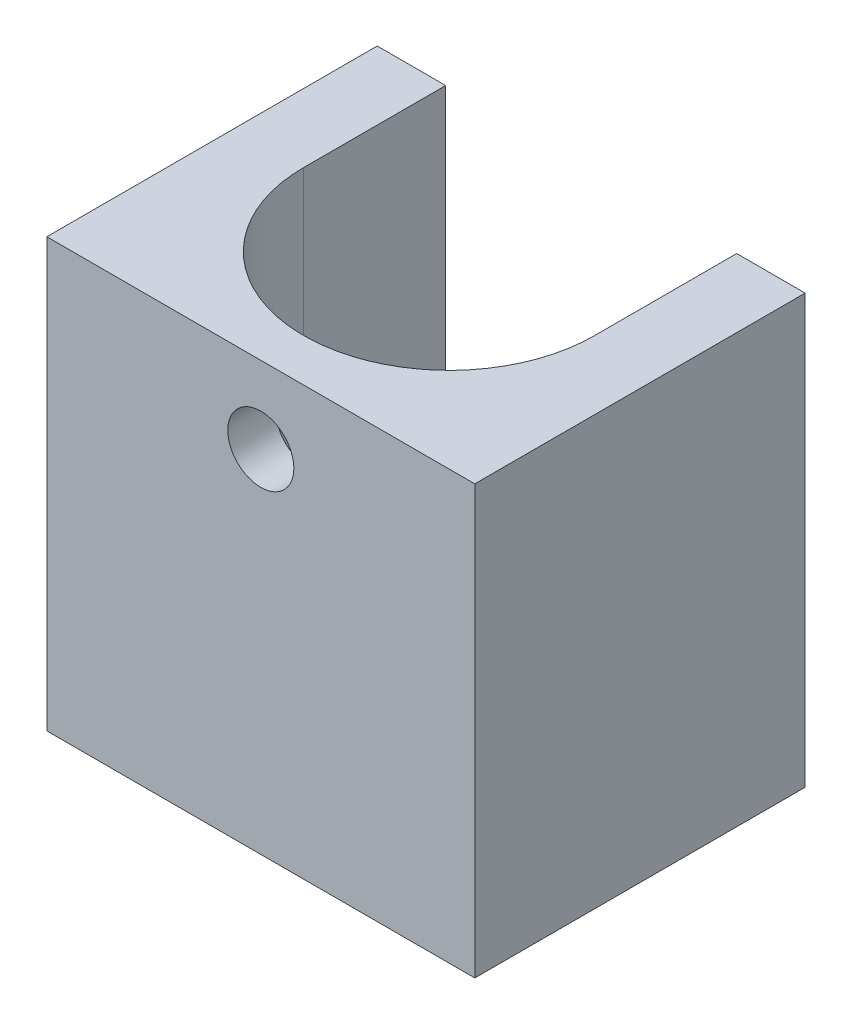
ISO-10303-21;
HEADER;
FILE_DESCRIPTION(('STEP AP214'),'2;1');
FILE_NAME('part.step','',(''),(''),'','','');
FILE_SCHEMA(('AUTOMOTIVE_DESIGN { 1 0 10303 214 1 1 1 1 }'));
ENDSEC;
DATA;
#1=APPLICATION_CONTEXT('core data for automotive mechanical design processes');
#2=APPLICATION_PROTOCOL_DEFINITION('international standard','automotive_design',2000,#1);
#3=PRODUCT_CONTEXT('',#1,'mechanical');
#4=PRODUCT('Part','Part','',(#3));
#5=PRODUCT_RELATED_PRODUCT_CATEGORY('part','',(#4));
#6=PRODUCT_DEFINITION_FORMATION('','',#4);
#7=PRODUCT_DEFINITION_CONTEXT('part definition',#1,'design');
#8=PRODUCT_DEFINITION('design','',#6,#7);
#9=PRODUCT_DEFINITION_SHAPE('','',#8);
#10=(LENGTH_UNIT() NAMED_UNIT(*) SI_UNIT(.MILLI.,.METRE.));
#11=(NAMED_UNIT(*) PLANE_ANGLE_UNIT() SI_UNIT($,.RADIAN.));
#12=(NAMED_UNIT(*) SI_UNIT($,.STERADIAN.) SOLID_ANGLE_UNIT());
#13=UNCERTAINTY_MEASURE_WITH_UNIT(LENGTH_MEASURE(1.E-05),#10,'distance_accuracy_value','');
#14=(GEOMETRIC_REPRESENTATION_CONTEXT(3) GLOBAL_UNCERTAINTY_ASSIGNED_CONTEXT((#13)) GLOBAL_UNIT_ASSIGNED_CONTEXT((#10,
#11,#12)) REPRESENTATION_CONTEXT('',''));
#15=CARTESIAN_POINT('',(0.,0.,0.));
#16=DIRECTION('',(0.,0.,1.));
#17=DIRECTION('',(1.,0.,0.));
#18=AXIS2_PLACEMENT_3D('',#15,#16,#17);
#19=CARTESIAN_POINT('',(15.875,31.75,1.5875));
#20=DIRECTION('',(-1.,0.,0.));
#21=DIRECTION('',(0.,0.,1.));
#22=AXIS2_PLACEMENT_3D('',#19,#20,#21);
#23=PLANE('',#22);
#24=DIRECTION('',(0.,0.,-1.));
#25=VECTOR('',#24,1.);
#26=CARTESIAN_POINT('',(15.875,0.,1.5875));
#27=LINE('',#26,#25);
#28=CARTESIAN_POINT('',(15.875,0.,1.5875));
#29=VERTEX_POINT('',#28);
#30=CARTESIAN_POINT('',(15.875,0.,-22.9235));
#31=VERTEX_POINT('',#30);
#32=EDGE_CURVE('E104',#29,#31,#27,.T.);
#33=ORIENTED_EDGE('',*,*,#32,.T.);
#34=DIRECTION('',(0.,1.,0.));
#35=VECTOR('',#34,1.);
#36=CARTESIAN_POINT('',(15.875,0.,-22.9235));
#37=LINE('',#36,#35);
#38=CARTESIAN_POINT('',(15.875,31.75,-22.9235));
#39=VERTEX_POINT('',#38);
#40=EDGE_CURVE('E108',#31,#39,#37,.T.);
#41=ORIENTED_EDGE('',*,*,#40,.T.);
#42=DIRECTION('',(0.,0.,-1.));
#43=VECTOR('',#42,1.);
#44=CARTESIAN_POINT('',(15.875,31.75,1.5875));
#45=LINE('',#44,#43);
#46=CARTESIAN_POINT('',(15.875,31.75,1.5875));
#47=VERTEX_POINT('',#46);
#48=EDGE_CURVE('E159',#47,#39,#45,.T.);
#49=ORIENTED_EDGE('',*,*,#48,.F.);
#50=DIRECTION('',(0.,-1.,0.));
#51=VECTOR('',#50,1.);
#52=CARTESIAN_POINT('',(15.875,31.75,1.5875));
#53=LINE('',#52,#51);
#54=EDGE_CURVE('E109',#47,#29,#53,.T.);
#55=ORIENTED_EDGE('',*,*,#54,.T.);
#56=EDGE_LOOP('',(#33,#41,#49,#55));
#57=FACE_BOUND('',#56,.T.);
#58=ADVANCED_FACE('F33',(#57),#23,.F.);
#59=CARTESIAN_POINT('',(-15.875,31.75,1.5875));
#60=DIRECTION('',(1.,0.,0.));
#61=DIRECTION('',(0.,0.,-1.));
#62=AXIS2_PLACEMENT_3D('',#59,#60,#61);
#63=PLANE('',#62);
#64=DIRECTION('',(0.,0.,1.));
#65=VECTOR('',#64,1.);
#66=CARTESIAN_POINT('',(-15.875,0.,1.5875));
#67=LINE('',#66,#65);
#68=CARTESIAN_POINT('',(-15.875,0.,-22.9235));
#69=VERTEX_POINT('',#68);
#70=CARTESIAN_POINT('',(-15.875,0.,1.5875));
#71=VERTEX_POINT('',#70);
#72=EDGE_CURVE('E61',#69,#71,#67,.T.);
#73=ORIENTED_EDGE('',*,*,#72,.T.);
#74=DIRECTION('',(0.,-1.,0.));
#75=VECTOR('',#74,1.);
#76=CARTESIAN_POINT('',(-15.875,31.75,1.5875));
#77=LINE('',#76,#75);
#78=CARTESIAN_POINT('',(-15.875,31.75,1.5875));
#79=VERTEX_POINT('',#78);
#80=EDGE_CURVE('E168',#79,#71,#77,.T.);
#81=ORIENTED_EDGE('',*,*,#80,.F.);
#82=DIRECTION('',(0.,0.,1.));
#83=VECTOR('',#82,1.);
#84=CARTESIAN_POINT('',(-15.875,31.75,1.5875));
#85=LINE('',#84,#83);
#86=CARTESIAN_POINT('',(-15.875,31.75,-22.9235));
#87=VERTEX_POINT('',#86);
#88=EDGE_CURVE('E161',#87,#79,#85,.T.);
#89=ORIENTED_EDGE('',*,*,#88,.F.);
#90=DIRECTION('',(0.,1.,0.));
#91=VECTOR('',#90,1.);
#92=CARTESIAN_POINT('',(-15.875,0.,-22.9235));
#93=LINE('',#92,#91);
#94=EDGE_CURVE('E145',#69,#87,#93,.T.);
#95=ORIENTED_EDGE('',*,*,#94,.F.);
#96=EDGE_LOOP('',(#73,#81,#89,#95));
#97=FACE_BOUND('',#96,.T.);
#98=ADVANCED_FACE('F207',(#97),#63,.F.);
#99=CARTESIAN_POINT('',(-15.875,31.75,1.5875));
#100=DIRECTION('',(0.,0.,-1.));
#101=DIRECTION('',(-1.,0.,0.));
#102=AXIS2_PLACEMENT_3D('',#99,#100,#101);
#103=PLANE('',#102);
#104=CARTESIAN_POINT('',(0.,26.035,1.5875));
#105=DIRECTION('',(0.,0.,1.));
#106=DIRECTION('',(1.,0.,0.));
#107=AXIS2_PLACEMENT_3D('',#104,#105,#106);
#108=CIRCLE('',#107,2.4511);
#109=CARTESIAN_POINT('',(2.4511,26.035,1.5875));
#110=VERTEX_POINT('',#109);
#111=EDGE_CURVE('E179',#110,#110,#108,.T.);
#112=ORIENTED_EDGE('',*,*,#111,.F.);
#113=EDGE_LOOP('',(#112));
#114=FACE_BOUND('',#113,.T.);
#115=DIRECTION('',(1.,0.,0.));
#116=VECTOR('',#115,1.);
#117=CARTESIAN_POINT('',(-15.875,0.,1.5875));
#118=LINE('',#117,#116);
#119=EDGE_CURVE('E162',#71,#29,#118,.T.);
#120=ORIENTED_EDGE('',*,*,#119,.T.);
#121=ORIENTED_EDGE('',*,*,#54,.F.);
#122=DIRECTION('',(1.,0.,0.));
#123=VECTOR('',#122,1.);
#124=CARTESIAN_POINT('',(-15.875,31.75,1.5875));
#125=LINE('',#124,#123);
#126=EDGE_CURVE('E50',#79,#47,#125,.T.);
#127=ORIENTED_EDGE('',*,*,#126,.F.);
#128=ORIENTED_EDGE('',*,*,#80,.T.);
#129=EDGE_LOOP('',(#120,#121,#127,#128));
#130=FACE_BOUND('',#129,.T.);
#131=ADVANCED_FACE('F211',(#114,#130),#103,.F.);
#132=CARTESIAN_POINT('',(0.,31.75,0.));
#133=DIRECTION('',(0.,-1.,0.));
#134=DIRECTION('',(0.,0.,-1.));
#135=AXIS2_PLACEMENT_3D('',#132,#133,#134);
#136=PLANE('',#135);
#137=ORIENTED_EDGE('',*,*,#48,.T.);
#138=DIRECTION('',(1.,0.,0.));
#139=VECTOR('',#138,1.);
#140=CARTESIAN_POINT('',(10.795,31.75,-22.9235));
#141=LINE('',#140,#139);
#142=CARTESIAN_POINT('',(10.795,31.75,-22.9235));
#143=VERTEX_POINT('',#142);
#144=EDGE_CURVE('E127',#143,#39,#141,.T.);
#145=ORIENTED_EDGE('',*,*,#144,.F.);
#146=DIRECTION('',(0.,0.,-1.));
#147=VECTOR('',#146,1.);
#148=CARTESIAN_POINT('',(10.795,31.75,-12.3825));
#149=LINE('',#148,#147);
#150=CARTESIAN_POINT('',(10.795,31.75,-12.3825));
#151=VERTEX_POINT('',#150);
#152=EDGE_CURVE('E122',#151,#143,#149,.T.);
#153=ORIENTED_EDGE('',*,*,#152,.F.);
#154=CARTESIAN_POINT('',(0.,31.75,-12.3825));
#155=DIRECTION('',(0.,-1.,0.));
#156=DIRECTION('',(0.,0.,1.));
#157=AXIS2_PLACEMENT_3D('',#154,#155,#156);
#158=CIRCLE('',#157,10.795);
#159=CARTESIAN_POINT('',(-10.795,31.75,-12.3825));
#160=VERTEX_POINT('',#159);
#161=EDGE_CURVE('E152',#151,#160,#158,.T.);
#162=ORIENTED_EDGE('',*,*,#161,.T.);
#163=DIRECTION('',(0.,0.,-1.));
#164=VECTOR('',#163,1.);
#165=CARTESIAN_POINT('',(-10.795,31.75,-12.3825));
#166=LINE('',#165,#164);
#167=CARTESIAN_POINT('',(-10.795,31.75,-22.9235));
#168=VERTEX_POINT('',#167);
#169=EDGE_CURVE('E70',#160,#168,#166,.T.);
#170=ORIENTED_EDGE('',*,*,#169,.T.);
#171=DIRECTION('',(-1.,0.,0.));
#172=VECTOR('',#171,1.);
#173=CARTESIAN_POINT('',(-10.795,31.75,-22.9235));
#174=LINE('',#173,#172);
#175=EDGE_CURVE('E138',#168,#87,#174,.T.);
#176=ORIENTED_EDGE('',*,*,#175,.T.);
#177=ORIENTED_EDGE('',*,*,#88,.T.);
#178=ORIENTED_EDGE('',*,*,#126,.T.);
#179=EDGE_LOOP('',(#137,#145,#153,#162,#170,#176,#177,#178));
#180=FACE_BOUND('',#179,.T.);
#181=ADVANCED_FACE('F216',(#180),#136,.F.);
#182=CARTESIAN_POINT('',(0.,0.,0.));
#183=DIRECTION('',(0.,-1.,0.));
#184=DIRECTION('',(0.,0.,-1.));
#185=AXIS2_PLACEMENT_3D('',#182,#183,#184);
#186=PLANE('',#185);
#187=ORIENTED_EDGE('',*,*,#32,.F.);
#188=ORIENTED_EDGE('',*,*,#119,.F.);
#189=ORIENTED_EDGE('',*,*,#72,.F.);
#190=DIRECTION('',(-1.,0.,0.));
#191=VECTOR('',#190,1.);
#192=CARTESIAN_POINT('',(-10.795,0.,-22.9235));
#193=LINE('',#192,#191);
#194=CARTESIAN_POINT('',(-10.795,0.,-22.9235));
#195=VERTEX_POINT('',#194);
#196=EDGE_CURVE('E137',#195,#69,#193,.T.);
#197=ORIENTED_EDGE('',*,*,#196,.F.);
#198=DIRECTION('',(0.,0.,-1.));
#199=VECTOR('',#198,1.);
#200=CARTESIAN_POINT('',(-10.795,0.,-12.3825));
#201=LINE('',#200,#199);
#202=CARTESIAN_POINT('',(-10.795,0.,-12.3825));
#203=VERTEX_POINT('',#202);
#204=EDGE_CURVE('E134',#203,#195,#201,.T.);
#205=ORIENTED_EDGE('',*,*,#204,.F.);
#206=CARTESIAN_POINT('',(0.,0.,-12.3825));
#207=DIRECTION('',(0.,-1.,0.));
#208=DIRECTION('',(0.,0.,1.));
#209=AXIS2_PLACEMENT_3D('',#206,#207,#208);
#210=CIRCLE('',#209,10.795);
#211=CARTESIAN_POINT('',(10.795,0.,-12.3825));
#212=VERTEX_POINT('',#211);
#213=EDGE_CURVE('E153',#212,#203,#210,.T.);
#214=ORIENTED_EDGE('',*,*,#213,.F.);
#215=DIRECTION('',(0.,0.,-1.));
#216=VECTOR('',#215,1.);
#217=CARTESIAN_POINT('',(10.795,0.,-12.3825));
#218=LINE('',#217,#216);
#219=CARTESIAN_POINT('',(10.795,0.,-22.9235));
#220=VERTEX_POINT('',#219);
#221=EDGE_CURVE('E118',#212,#220,#218,.T.);
#222=ORIENTED_EDGE('',*,*,#221,.T.);
#223=DIRECTION('',(1.,0.,0.));
#224=VECTOR('',#223,1.);
#225=CARTESIAN_POINT('',(10.795,0.,-22.9235));
#226=LINE('',#225,#224);
#227=EDGE_CURVE('E115',#220,#31,#226,.T.);
#228=ORIENTED_EDGE('',*,*,#227,.T.);
#229=EDGE_LOOP('',(#187,#188,#189,#197,#205,#214,#222,#228));
#230=FACE_BOUND('',#229,.T.);
#231=ADVANCED_FACE('F116',(#230),#186,.T.);
#232=CARTESIAN_POINT('',(0.,0.,-12.3825));
#233=DIRECTION('',(0.,1.,0.));
#234=DIRECTION('',(0.,0.,1.));
#235=AXIS2_PLACEMENT_3D('',#232,#233,#234);
#236=CYLINDRICAL_SURFACE('',#235,10.795);
#237=CARTESIAN_POINT('',(2.4511,26.035,-1.86945411452989));
#238=CARTESIAN_POINT('',(2.45109551657339,25.8992385647191,-1.86945137988655));
#239=CARTESIAN_POINT('',(2.43978229509358,25.7634243892459,-1.86679569446525));
#240=CARTESIAN_POINT('',(2.39488352706888,25.4956679358303,-1.85648131616208));
#241=CARTESIAN_POINT('',(2.36128268357308,25.3637283822009,-1.84881918719726));
#242=CARTESIAN_POINT('',(2.27292914712487,25.1076329545504,-1.8294034216649));
#243=CARTESIAN_POINT('',(2.2182006959268,24.9834683486512,-1.81765447582213));
#244=CARTESIAN_POINT('',(2.08921609937483,24.7460775519232,-1.79139457522772));
#245=CARTESIAN_POINT('',(2.01496003756254,24.6328513143014,-1.77688363229232));
#246=CARTESIAN_POINT('',(1.84758764883782,24.4184908665674,-1.74643972382931));
#247=CARTESIAN_POINT('',(1.7541827493001,24.3175846844,-1.73048738401224));
#248=CARTESIAN_POINT('',(1.55178673578117,24.1327287816545,-1.69912731909613));
#249=CARTESIAN_POINT('',(1.4427943521549,24.0487804436864,-1.68371963848878));
#250=CARTESIAN_POINT('',(1.21077983927412,23.8993133000295,-1.65497304393858));
#251=CARTESIAN_POINT('',(1.08761220845082,23.8340150202305,-1.64165965913653));
#252=CARTESIAN_POINT('',(0.831698355762017,23.7251300940949,-1.61882111889364));
#253=CARTESIAN_POINT('',(0.698953296077552,23.6815408185172,-1.60929550473299));
#254=CARTESIAN_POINT('',(0.430025446144308,23.6180318053806,-1.59524270861322));
#255=CARTESIAN_POINT('',(0.293938208796798,23.5977257865641,-1.59063404436912));
#256=CARTESIAN_POINT('',(0.0202159414176339,23.5801507469782,-1.58665169097462));
#257=CARTESIAN_POINT('',(-0.117418896302671,23.5828788948007,-1.58727735840909));
#258=CARTESIAN_POINT('',(-0.38766242117977,23.6110095558131,-1.59363130971424));
#259=CARTESIAN_POINT('',(-0.520316993926628,23.6359955641814,-1.5992658598179));
#260=CARTESIAN_POINT('',(-0.779499489349328,23.7072675116714,-1.61489710045296));
#261=CARTESIAN_POINT('',(-0.906027121011284,23.7535544614382,-1.62489399795927));
#262=CARTESIAN_POINT('',(-1.15050525950098,23.866474692438,-1.64827556084979));
#263=CARTESIAN_POINT('',(-1.26838142622191,23.9332633763019,-1.6616859631246));
#264=CARTESIAN_POINT('',(-1.49140333521147,24.0851748369029,-1.6904280081327));
#265=CARTESIAN_POINT('',(-1.59654721497863,24.1703002909262,-1.70575993128354));
#266=CARTESIAN_POINT('',(-1.79359914114175,24.3587278753166,-1.73706819729189));
#267=CARTESIAN_POINT('',(-1.8851579418584,24.462394455503,-1.75305128219082));
#268=CARTESIAN_POINT('',(-2.04965976622867,24.6837768141966,-1.78354063775779));
#269=CARTESIAN_POINT('',(-2.12260220269674,24.8014930356769,-1.79804686183494));
#270=CARTESIAN_POINT('',(-2.24797288646644,25.0482280580757,-1.82395965158318));
#271=CARTESIAN_POINT('',(-2.30033058957397,25.177283903339,-1.83535551791847));
#272=CARTESIAN_POINT('',(-2.38250725441049,25.4426834868247,-1.85361236566932));
#273=CARTESIAN_POINT('',(-2.41233010083876,25.5790259645909,-1.86047412867631));
#274=CARTESIAN_POINT('',(-2.44803929084549,25.8519251762944,-1.86872521161657));
#275=CARTESIAN_POINT('',(-2.45443615471404,25.9884116588022,-1.87023122745461));
#276=CARTESIAN_POINT('',(-2.44449792636048,26.2605009167012,-1.86791582346201));
#277=CARTESIAN_POINT('',(-2.42816452754027,26.3961037571675,-1.8640948004951));
#278=CARTESIAN_POINT('',(-2.37367361112137,26.6607692308361,-1.85166647205575));
#279=CARTESIAN_POINT('',(-2.33580131151684,26.78989379925,-1.84312175822665));
#280=CARTESIAN_POINT('',(-2.23961833074065,27.0399641320085,-1.82226603877276));
#281=CARTESIAN_POINT('',(-2.18130557011413,27.1609090627259,-1.80995464997173));
#282=CARTESIAN_POINT('',(-2.04478660832421,27.3933845229124,-1.78269910306353));
#283=CARTESIAN_POINT('',(-1.96626826751949,27.5047269564382,-1.76771488410141));
#284=CARTESIAN_POINT('',(-1.79197187700737,27.7128428771493,-1.73690574447668));
#285=CARTESIAN_POINT('',(-1.69619150892132,27.809614404179,-1.72108071108994));
#286=CARTESIAN_POINT('',(-1.48777125744117,27.9878449609163,-1.68998558385414));
#287=CARTESIAN_POINT('',(-1.37482949983063,28.0689546079405,-1.67473319329757));
#288=CARTESIAN_POINT('',(-1.13662823522811,28.2110507228593,-1.64683704251017));
#289=CARTESIAN_POINT('',(-1.01136932608201,28.2720381668138,-1.63419315576085));
#290=CARTESIAN_POINT('',(-0.752898237712931,28.3716830438699,-1.6130127906031));
#291=CARTESIAN_POINT('',(-0.619745181824444,28.4104878271266,-1.60444927286232));
#292=CARTESIAN_POINT('',(-0.348592194650648,28.4651221827935,-1.59227720483653));
#293=CARTESIAN_POINT('',(-0.210593029323826,28.4809553694202,-1.58866787509344));
#294=CARTESIAN_POINT('',(0.0630272824102845,28.4890240811924,-1.58683621597853));
#295=CARTESIAN_POINT('',(0.198632556602191,28.4817796314666,-1.58849516990883));
#296=CARTESIAN_POINT('',(0.466639056414581,28.4450689888784,-1.59675706322704));
#297=CARTESIAN_POINT('',(0.599040348495133,28.4156032573597,-1.6033598999733));
#298=CARTESIAN_POINT('',(0.856441811985607,28.3355436900097,-1.6207563718037));
#299=CARTESIAN_POINT('',(0.98146767759858,28.2850288393749,-1.63153432954092));
#300=CARTESIAN_POINT('',(1.22133565824005,28.1643800596308,-1.65613442395706));
#301=CARTESIAN_POINT('',(1.33617670233111,28.094244070566,-1.66995688023494));
#302=CARTESIAN_POINT('',(1.5549343848025,27.9346760989075,-1.69949259614361));
#303=CARTESIAN_POINT('',(1.65858218790924,27.8448815791392,-1.71523852122719));
#304=CARTESIAN_POINT('',(1.84951577375057,27.6492699263712,-1.746678399028));
#305=CARTESIAN_POINT('',(1.93679756335916,27.5434488944356,-1.76237233814606));
#306=CARTESIAN_POINT('',(2.09376094876377,27.3169215061993,-1.79218919509268));
#307=CARTESIAN_POINT('',(2.16316577749683,27.1960196794768,-1.80628570988399));
#308=CARTESIAN_POINT('',(2.28056099631998,26.9439699925706,-1.83097441308363));
#309=CARTESIAN_POINT('',(2.32856887958051,26.8128306056215,-1.84156946229221));
#310=CARTESIAN_POINT('',(2.39359231356141,26.5738689350366,-1.85617225301184));
#311=CARTESIAN_POINT('',(2.41511496243131,26.4673075957751,-1.8611188126826));
#312=CARTESIAN_POINT('',(2.44387019392053,26.2521753451188,-1.86776074510399));
#313=CARTESIAN_POINT('',(2.45110358658937,26.1436045479914,-1.86945630215189));
#314=CARTESIAN_POINT('',(2.4511,26.035,-1.86945411452989));
#315=B_SPLINE_CURVE_WITH_KNOTS('',3,(#237,#238,#239,#240,#241,#242,#243,#244,#245,#246,#247,
#248,#249,#250,#251,#252,#253,#254,#255,#256,#257,#258,#259,#260,#261,#262,#263,#264,#265,#266,
#267,#268,#269,#270,#271,#272,#273,#274,#275,#276,#277,#278,#279,#280,#281,#282,#283,#284,#285,
#286,#287,#288,#289,#290,#291,#292,#293,#294,#295,#296,#297,#298,#299,#300,#301,#302,#303,#304,
#305,#306,#307,#308,#309,#310,#311,#312,#313,#314),.UNSPECIFIED.,.T.,.F.,(4,2,2,2,2,2,2,2,2,2,2,
2,2,2,2,2,2,2,2,2,2,2,2,2,2,2,2,2,2,2,2,2,2,2,2,2,2,2,4),(0.,0.406886085689346,0.81405172411338,
1.22075156382069,1.62744966364263,2.04079870320537,2.45418143042246,2.87226695182918,
3.29030182535266,3.70129609668412,4.1122398484736,4.51565159535922,4.91908248450469,
5.32565021282315,5.73227734292792,6.14801305711805,6.56376188256033,6.98092331875166,
7.398012825634,7.80595675159038,8.21387028739924,8.61650397400539,9.0191786333511,
9.4284923495689,9.83786107973626,10.2555114848227,10.6731416281272,11.0879643925478,
11.5027218841055,11.9082000068874,12.3136697116311,12.7176314320525,13.1216355789477,
13.5338343995732,13.9461336616497,14.3644770264587,14.7824777425349,15.1079912775802,
15.4334863589252),.UNSPECIFIED.);
#316=CARTESIAN_POINT('',(2.4511,26.035,-1.86945411452989));
#317=VERTEX_POINT('',#316);
#318=EDGE_CURVE('E178',#317,#317,#315,.T.);
#319=ORIENTED_EDGE('',*,*,#318,.F.);
#320=EDGE_LOOP('',(#319));
#321=FACE_BOUND('',#320,.T.);
#322=CARTESIAN_POINT('',(2.3241,5.715,-1.84065081733759));
#323=CARTESIAN_POINT('',(2.32409549916853,5.58608801167659,-1.84064821357379));
#324=CARTESIAN_POINT('',(2.31333789447695,5.45712144725881,-1.83826045264815));
#325=CARTESIAN_POINT('',(2.27063666469204,5.20285224756553,-1.82898428251789));
#326=CARTESIAN_POINT('',(2.23867741352945,5.07755238589983,-1.82209255384798));
#327=CARTESIAN_POINT('',(2.15462281981134,4.83433157004479,-1.80462433023636));
#328=CARTESIAN_POINT('',(2.10254917805871,4.71640282214666,-1.79405180760012));
#329=CARTESIAN_POINT('',(1.97980559638182,4.4909539911621,-1.7704180221684));
#330=CARTESIAN_POINT('',(1.90913616266839,4.38343362484981,-1.75735682712173));
#331=CARTESIAN_POINT('',(1.74997391208941,4.18009115052826,-1.7299784905816));
#332=CARTESIAN_POINT('',(1.66123436766572,4.0844642360694,-1.71564570935788));
#333=CARTESIAN_POINT('',(1.46898359629591,3.9093316462539,-1.68747620134756));
#334=CARTESIAN_POINT('',(1.36547124419553,3.82982719996454,-1.67363951244581));
#335=CARTESIAN_POINT('',(1.14530752556467,3.68842704041883,-1.64785119376009));
#336=CARTESIAN_POINT('',(1.02853323423502,3.62671864356541,-1.63592016755287));
#337=CARTESIAN_POINT('',(0.785972738384682,3.52387353333355,-1.61546395590055));
#338=CARTESIAN_POINT('',(0.660187514811959,3.4827345846031,-1.6069384003916));
#339=CARTESIAN_POINT('',(0.405204601239005,3.42280888394178,-1.59436424385058));
#340=CARTESIAN_POINT('',(0.276087832108875,3.40369191263341,-1.59024956870552));
#341=CARTESIAN_POINT('',(0.0164186359863088,3.38732078333478,-1.58673199587417));
#342=CARTESIAN_POINT('',(-0.114133630066289,3.3900641989426,-1.58732857526034));
#343=CARTESIAN_POINT('',(-0.37069287468052,3.41708917026506,-1.59311566285806));
#344=CARTESIAN_POINT('',(-0.496739305018645,3.4410148367135,-1.59823025936706));
#345=CARTESIAN_POINT('',(-0.742985078548615,3.50915852679532,-1.61239237881637));
#346=CARTESIAN_POINT('',(-0.863184162580599,3.55337744894018,-1.62144007589911));
#347=CARTESIAN_POINT('',(-1.09531635118184,3.66117004500266,-1.6425744438013));
#348=CARTESIAN_POINT('',(-1.20718440596387,3.72487947560982,-1.65468232336445));
#349=CARTESIAN_POINT('',(-1.4187719075133,3.86974353106392,-1.68060807878991));
#350=CARTESIAN_POINT('',(-1.51848974481196,3.95090046315248,-1.69442618070783));
#351=CARTESIAN_POINT('',(-1.70506199778786,4.1302961698157,-1.72258050986985));
#352=CARTESIAN_POINT('',(-1.79161643918747,4.22884642807024,-1.73692156621258));
#353=CARTESIAN_POINT('',(-1.94702454309359,4.43921098642764,-1.76424379338079));
#354=CARTESIAN_POINT('',(-2.01587775550452,4.55102562370306,-1.77722492962212));
#355=CARTESIAN_POINT('',(-2.13405650103444,4.7852196099782,-1.80036971259848));
#356=CARTESIAN_POINT('',(-2.1833268910939,4.90762762648352,-1.81052537936753));
#357=CARTESIAN_POINT('',(-2.26050889518193,5.15925581705973,-1.82675767005626));
#358=CARTESIAN_POINT('',(-2.28842378101071,5.28847494438092,-1.83283491879821));
#359=CARTESIAN_POINT('',(-2.32164031071771,5.54732051382643,-1.84009526661486));
#360=CARTESIAN_POINT('',(-2.32737805766406,5.67688841051796,-1.84137273687599));
#361=CARTESIAN_POINT('',(-2.31725677559342,5.93512946212979,-1.83914322091602));
#362=CARTESIAN_POINT('',(-2.30139918046272,6.06380267588504,-1.83563655235185));
#363=CARTESIAN_POINT('',(-2.24891528022135,6.31509332486663,-1.82432284838605));
#364=CARTESIAN_POINT('',(-2.21252780782195,6.43776307486274,-1.81656529466842));
#365=CARTESIAN_POINT('',(-2.12027504386097,6.67526475888912,-1.79766830156874));
#366=CARTESIAN_POINT('',(-2.0644079360319,6.79009596086445,-1.78652854684518));
#367=CARTESIAN_POINT('',(-1.93381597177833,7.01055214716111,-1.76191409658133));
#368=CARTESIAN_POINT('',(-1.85882166535315,7.11601382383576,-1.74840698191336));
#369=CARTESIAN_POINT('',(-1.69245793211979,7.31301542935101,-1.72066586705102));
#370=CARTESIAN_POINT('',(-1.6010865381942,7.40455368334931,-1.70643177968407));
#371=CARTESIAN_POINT('',(-1.40259184210669,7.57279528439484,-1.67853036528208));
#372=CARTESIAN_POINT('',(-1.29521448946444,7.64920176945319,-1.66487786221087));
#373=CARTESIAN_POINT('',(-1.06889511097286,7.78289131259676,-1.63994772555763));
#374=CARTESIAN_POINT('',(-0.949953616260635,7.84017524843889,-1.6286699829789));
#375=CARTESIAN_POINT('',(-0.70461115635195,7.9335765141561,-1.60982272494732));
#376=CARTESIAN_POINT('',(-0.578262155412469,7.96982548763475,-1.60223019627603));
#377=CARTESIAN_POINT('',(-0.321086575208692,8.02054018873908,-1.59150948202477));
#378=CARTESIAN_POINT('',(-0.190260628169091,8.03500897923839,-1.58838066873081));
#379=CARTESIAN_POINT('',(0.0693337835484437,8.04161848542044,-1.58695783724294));
#380=CARTESIAN_POINT('',(0.198090623430024,8.03420299887275,-1.58856771989476));
#381=CARTESIAN_POINT('',(0.45247708382195,7.99824470841324,-1.59623622773323));
#382=CARTESIAN_POINT('',(0.578106757138823,7.96970226150984,-1.60229477774523));
#383=CARTESIAN_POINT('',(0.822342049503379,7.89251011055789,-1.61817359141995));
#384=CARTESIAN_POINT('',(0.940967782299849,7.8439215425697,-1.62798241101468));
#385=CARTESIAN_POINT('',(1.16844294591253,7.72807672161222,-1.65031271394251));
#386=CARTESIAN_POINT('',(1.27729145867889,7.66081871806251,-1.66283445163413));
#387=CARTESIAN_POINT('',(1.48429286330316,7.50808764574725,-1.68951143459885));
#388=CARTESIAN_POINT('',(1.5822114017252,7.42230143919337,-1.70369255302225));
#389=CARTESIAN_POINT('',(1.76241489830367,7.23558303118231,-1.73194798816666));
#390=CARTESIAN_POINT('',(1.8446960971014,7.13464719802923,-1.74602227842642));
#391=CARTESIAN_POINT('',(1.99230649529636,6.91893378563267,-1.77267186764697));
#392=CARTESIAN_POINT('',(2.05740400780185,6.80399484911991,-1.78522555450833));
#393=CARTESIAN_POINT('',(2.16725593021615,6.56456432966837,-1.80714238514725));
#394=CARTESIAN_POINT('',(2.21202779427438,6.44008105049755,-1.81650826463921));
#395=CARTESIAN_POINT('',(2.2718326314788,6.21536689033962,-1.82923102497007));
#396=CARTESIAN_POINT('',(2.29139579328741,6.11636753101965,-1.83348538802752));
#397=CARTESIAN_POINT('',(2.31753094015176,5.9165898521185,-1.83919623828665));
#398=CARTESIAN_POINT('',(2.32410351973537,5.8158116141626,-1.84065285353015));
#399=CARTESIAN_POINT('',(2.3241,5.715,-1.84065081733759));
#400=B_SPLINE_CURVE_WITH_KNOTS('',3,(#322,#323,#324,#325,#326,#327,#328,#329,#330,#331,#332,
#333,#334,#335,#336,#337,#338,#339,#340,#341,#342,#343,#344,#345,#346,#347,#348,#349,#350,#351,
#352,#353,#354,#355,#356,#357,#358,#359,#360,#361,#362,#363,#364,#365,#366,#367,#368,#369,#370,
#371,#372,#373,#374,#375,#376,#377,#378,#379,#380,#381,#382,#383,#384,#385,#386,#387,#388,#389,
#390,#391,#392,#393,#394,#395,#396,#397,#398,#399),.UNSPECIFIED.,.T.,.F.,(4,2,2,2,2,2,2,2,2,2,2,
2,2,2,2,2,2,2,2,2,2,2,2,2,2,2,2,2,2,2,2,2,2,2,2,2,2,2,4),(0.,0.386366565834025,
0.773018208967746,1.15925386532188,1.5454790087359,1.93738153380907,2.32931392364194,
2.72523252132248,3.1211080838235,3.51096688691371,3.90078241808143,4.28417026339034,
4.66757508535517,5.05371369145446,5.43990339161338,5.83388141656827,6.22786945835496,
6.62295919755431,7.0179883943431,7.4052087842177,7.7924034647088,8.17518396890625,
8.55800017283615,8.94653977073716,9.3351260689946,9.73071067698705,10.1262771244885,
10.5193405208768,10.9123486369208,11.2974419460139,11.6825287478568,12.0664497046055,
12.4504066727092,12.8414467836493,13.2325807855959,13.6287463409493,14.0245710523997,
14.3267308467593,14.6288768121327),.UNSPECIFIED.);
#401=CARTESIAN_POINT('',(2.3241,5.715,-1.84065081733759));
#402=VERTEX_POINT('',#401);
#403=EDGE_CURVE('E170',#402,#402,#400,.T.);
#404=ORIENTED_EDGE('',*,*,#403,.F.);
#405=EDGE_LOOP('',(#404));
#406=FACE_BOUND('',#405,.T.);
#407=ORIENTED_EDGE('',*,*,#161,.F.);
#408=DIRECTION('',(0.,1.,0.));
#409=VECTOR('',#408,1.);
#410=CARTESIAN_POINT('',(10.795,0.,-12.3825));
#411=LINE('',#410,#409);
#412=EDGE_CURVE('E148',#212,#151,#411,.T.);
#413=ORIENTED_EDGE('',*,*,#412,.F.);
#414=ORIENTED_EDGE('',*,*,#213,.T.);
#415=DIRECTION('',(0.,1.,0.));
#416=VECTOR('',#415,1.);
#417=CARTESIAN_POINT('',(-10.795,0.,-12.3825));
#418=LINE('',#417,#416);
#419=EDGE_CURVE('E112',#203,#160,#418,.T.);
#420=ORIENTED_EDGE('',*,*,#419,.T.);
#421=EDGE_LOOP('',(#407,#413,#414,#420));
#422=FACE_BOUND('',#421,.T.);
#423=ADVANCED_FACE('F184',(#321,#406,#422),#236,.F.);
#424=CARTESIAN_POINT('',(-10.795,0.,-22.9235));
#425=DIRECTION('',(0.,0.,-1.));
#426=DIRECTION('',(-1.,0.,0.));
#427=AXIS2_PLACEMENT_3D('',#424,#425,#426);
#428=PLANE('',#427);
#429=ORIENTED_EDGE('',*,*,#175,.F.);
#430=DIRECTION('',(0.,1.,0.));
#431=VECTOR('',#430,1.);
#432=CARTESIAN_POINT('',(-10.795,0.,-22.9235));
#433=LINE('',#432,#431);
#434=EDGE_CURVE('E141',#195,#168,#433,.T.);
#435=ORIENTED_EDGE('',*,*,#434,.F.);
#436=ORIENTED_EDGE('',*,*,#196,.T.);
#437=ORIENTED_EDGE('',*,*,#94,.T.);
#438=EDGE_LOOP('',(#429,#435,#436,#437));
#439=FACE_BOUND('',#438,.T.);
#440=ADVANCED_FACE('F200',(#439),#428,.T.);
#441=CARTESIAN_POINT('',(-10.795,0.,-12.3825));
#442=DIRECTION('',(1.,0.,0.));
#443=DIRECTION('',(0.,0.,-1.));
#444=AXIS2_PLACEMENT_3D('',#441,#442,#443);
#445=PLANE('',#444);
#446=ORIENTED_EDGE('',*,*,#169,.F.);
#447=ORIENTED_EDGE('',*,*,#419,.F.);
#448=ORIENTED_EDGE('',*,*,#204,.T.);
#449=ORIENTED_EDGE('',*,*,#434,.T.);
#450=EDGE_LOOP('',(#446,#447,#448,#449));
#451=FACE_BOUND('',#450,.T.);
#452=ADVANCED_FACE('F196',(#451),#445,.T.);
#453=CARTESIAN_POINT('',(10.795,0.,-12.3825));
#454=DIRECTION('',(1.,0.,0.));
#455=DIRECTION('',(0.,0.,-1.));
#456=AXIS2_PLACEMENT_3D('',#453,#454,#455);
#457=PLANE('',#456);
#458=ORIENTED_EDGE('',*,*,#152,.T.);
#459=DIRECTION('',(0.,1.,0.));
#460=VECTOR('',#459,1.);
#461=CARTESIAN_POINT('',(10.795,0.,-22.9235));
#462=LINE('',#461,#460);
#463=EDGE_CURVE('E128',#220,#143,#462,.T.);
#464=ORIENTED_EDGE('',*,*,#463,.F.);
#465=ORIENTED_EDGE('',*,*,#221,.F.);
#466=ORIENTED_EDGE('',*,*,#412,.T.);
#467=EDGE_LOOP('',(#458,#464,#465,#466));
#468=FACE_BOUND('',#467,.T.);
#469=ADVANCED_FACE('F193',(#468),#457,.F.);
#470=CARTESIAN_POINT('',(10.795,0.,-22.9235));
#471=DIRECTION('',(0.,0.,1.));
#472=DIRECTION('',(1.,0.,0.));
#473=AXIS2_PLACEMENT_3D('',#470,#471,#472);
#474=PLANE('',#473);
#475=ORIENTED_EDGE('',*,*,#144,.T.);
#476=ORIENTED_EDGE('',*,*,#40,.F.);
#477=ORIENTED_EDGE('',*,*,#227,.F.);
#478=ORIENTED_EDGE('',*,*,#463,.T.);
#479=EDGE_LOOP('',(#475,#476,#477,#478));
#480=FACE_BOUND('',#479,.T.);
#481=ADVANCED_FACE('F125',(#480),#474,.F.);
#482=CARTESIAN_POINT('',(0.,26.035,-30.1625));
#483=DIRECTION('',(0.,0.,1.));
#484=DIRECTION('',(1.,0.,0.));
#485=AXIS2_PLACEMENT_3D('',#482,#483,#484);
#486=CYLINDRICAL_SURFACE('',#485,2.4511);
#487=ORIENTED_EDGE('',*,*,#318,.T.);
#488=EDGE_LOOP('',(#487));
#489=FACE_BOUND('',#488,.T.);
#490=ORIENTED_EDGE('',*,*,#111,.T.);
#491=EDGE_LOOP('',(#490));
#492=FACE_BOUND('',#491,.T.);
#493=ADVANCED_FACE('F190',(#489,#492),#486,.F.);
#494=CARTESIAN_POINT('',(0.,5.715,-14.2875));
#495=DIRECTION('',(0.,0.,1.));
#496=DIRECTION('',(1.,0.,0.));
#497=AXIS2_PLACEMENT_3D('',#494,#495,#496);
#498=CYLINDRICAL_SURFACE('',#497,2.3241);
#499=CARTESIAN_POINT('',(0.,5.715,-13.5255));
#500=DIRECTION('',(0.,0.,1.));
#501=DIRECTION('',(1.,0.,0.));
#502=AXIS2_PLACEMENT_3D('',#499,#500,#501);
#503=CIRCLE('',#502,2.3241);
#504=CARTESIAN_POINT('',(2.3241,5.715,-13.5255));
#505=VERTEX_POINT('',#504);
#506=EDGE_CURVE('E42',#505,#505,#503,.T.);
#507=ORIENTED_EDGE('',*,*,#506,.T.);
#508=EDGE_LOOP('',(#507));
#509=FACE_BOUND('',#508,.T.);
#510=ORIENTED_EDGE('',*,*,#403,.T.);
#511=EDGE_LOOP('',(#510));
#512=FACE_BOUND('',#511,.T.);
#513=ADVANCED_FACE('F243',(#509,#512),#498,.T.);
#514=CARTESIAN_POINT('',(0.,5.715,-14.2875));
#515=DIRECTION('',(0.,0.,1.));
#516=DIRECTION('',(1.,0.,0.));
#517=AXIS2_PLACEMENT_3D('',#514,#515,#516);
#518=PLANE('',#517);
#519=CARTESIAN_POINT('',(0.,5.715,-14.2875));
#520=DIRECTION('',(0.,0.,1.));
#521=DIRECTION('',(1.,0.,0.));
#522=AXIS2_PLACEMENT_3D('',#519,#520,#521);
#523=CIRCLE('',#522,1.5621);
#524=CARTESIAN_POINT('',(1.5621,5.715,-14.2875));
#525=VERTEX_POINT('',#524);
#526=EDGE_CURVE('E11',#525,#525,#523,.F.);
#527=ORIENTED_EDGE('',*,*,#526,.T.);
#528=EDGE_LOOP('',(#527));
#529=FACE_BOUND('',#528,.T.);
#530=ADVANCED_FACE('F245',(#529),#518,.F.);
#531=CARTESIAN_POINT('',(0.,5.715,-13.5255));
#532=DIRECTION('',(0.,0.,1.));
#533=DIRECTION('',(1.,0.,0.));
#534=AXIS2_PLACEMENT_3D('',#531,#532,#533);
#535=TOROIDAL_SURFACE('',#534,1.5621,0.762);
#536=ORIENTED_EDGE('',*,*,#526,.F.);
#537=EDGE_LOOP('',(#536));
#538=FACE_BOUND('',#537,.T.);
#539=ORIENTED_EDGE('',*,*,#506,.F.);
#540=EDGE_LOOP('',(#539));
#541=FACE_BOUND('',#540,.T.);
#542=ADVANCED_FACE('F35',(#538,#541),#535,.T.);
#543=CLOSED_SHELL('',(#58,#98,#131,#181,#231,#423,#440,#452,#469,#481,#493,#513,#530,#542));
#544=MANIFOLD_SOLID_BREP('B2',#543);
#545=ADVANCED_BREP_SHAPE_REPRESENTATION('',(#18,#544),#14);
#546=SHAPE_DEFINITION_REPRESENTATION(#9,#545);
ENDSEC;
END-ISO-10303-21;
